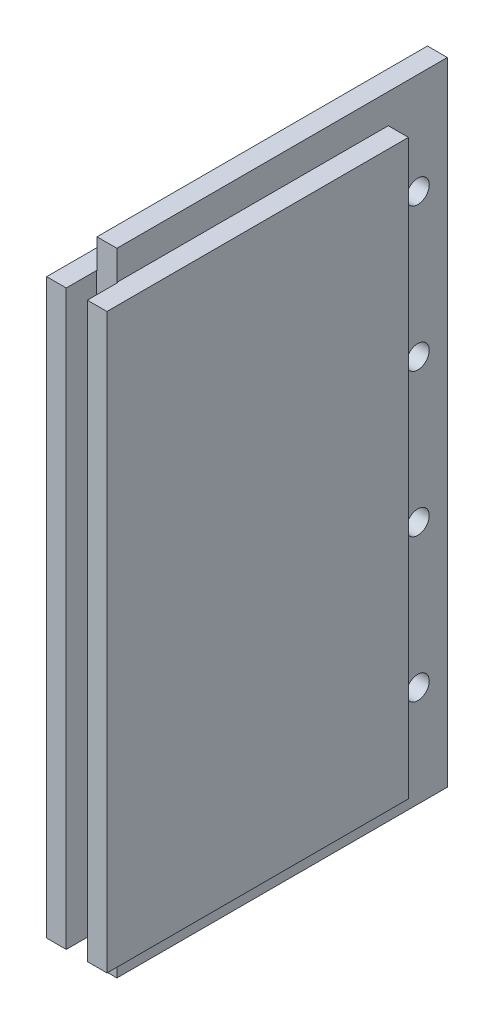
ISO-10303-21;
HEADER;
FILE_DESCRIPTION(('STEP AP214'),'2;1');
FILE_NAME('part.step','',(''),(''),'','','');
FILE_SCHEMA(('AUTOMOTIVE_DESIGN { 1 0 10303 214 1 1 1 1 }'));
ENDSEC;
DATA;
#1=APPLICATION_CONTEXT('core data for automotive mechanical design processes');
#2=APPLICATION_PROTOCOL_DEFINITION('international standard','automotive_design',2000,#1);
#3=PRODUCT_CONTEXT('',#1,'mechanical');
#4=PRODUCT('Part','Part','',(#3));
#5=PRODUCT_RELATED_PRODUCT_CATEGORY('part','',(#4));
#6=PRODUCT_DEFINITION_FORMATION('','',#4);
#7=PRODUCT_DEFINITION_CONTEXT('part definition',#1,'design');
#8=PRODUCT_DEFINITION('design','',#6,#7);
#9=PRODUCT_DEFINITION_SHAPE('','',#8);
#10=(LENGTH_UNIT() NAMED_UNIT(*) SI_UNIT(.MILLI.,.METRE.));
#11=(NAMED_UNIT(*) PLANE_ANGLE_UNIT() SI_UNIT($,.RADIAN.));
#12=(NAMED_UNIT(*) SI_UNIT($,.STERADIAN.) SOLID_ANGLE_UNIT());
#13=UNCERTAINTY_MEASURE_WITH_UNIT(LENGTH_MEASURE(1.E-05),#10,'distance_accuracy_value','');
#14=(GEOMETRIC_REPRESENTATION_CONTEXT(3) GLOBAL_UNCERTAINTY_ASSIGNED_CONTEXT((#13)) GLOBAL_UNIT_ASSIGNED_CONTEXT((#10,
#11,#12)) REPRESENTATION_CONTEXT('',''));
#15=CARTESIAN_POINT('',(0.,0.,0.));
#16=DIRECTION('',(0.,0.,1.));
#17=DIRECTION('',(1.,0.,0.));
#18=AXIS2_PLACEMENT_3D('',#15,#16,#17);
#19=CARTESIAN_POINT('',(-10.,0.,0.));
#20=DIRECTION('',(-1.,0.,0.));
#21=DIRECTION('',(0.,0.,1.));
#22=AXIS2_PLACEMENT_3D('',#19,#20,#21);
#23=PLANE('',#22);
#24=DIRECTION('',(0.,-1.,0.));
#25=VECTOR('',#24,1.);
#26=CARTESIAN_POINT('',(-10.,0.,42.5));
#27=LINE('',#26,#25);
#28=CARTESIAN_POINT('',(-10.,92.5,42.5));
#29=VERTEX_POINT('',#28);
#30=CARTESIAN_POINT('',(-10.,2.5,42.5));
#31=VERTEX_POINT('',#30);
#32=EDGE_CURVE('E200',#29,#31,#27,.T.);
#33=ORIENTED_EDGE('',*,*,#32,.T.);
#34=DIRECTION('',(0.,0.,-1.));
#35=VECTOR('',#34,1.);
#36=CARTESIAN_POINT('',(-10.,2.5,0.));
#37=LINE('',#36,#35);
#38=CARTESIAN_POINT('',(-10.,2.5,2.5));
#39=VERTEX_POINT('',#38);
#40=EDGE_CURVE('E11',#31,#39,#37,.T.);
#41=ORIENTED_EDGE('',*,*,#40,.T.);
#42=DIRECTION('',(0.,1.,0.));
#43=VECTOR('',#42,1.);
#44=CARTESIAN_POINT('',(-10.,90.,2.5));
#45=LINE('',#44,#43);
#46=CARTESIAN_POINT('',(-10.,92.5,2.5));
#47=VERTEX_POINT('',#46);
#48=EDGE_CURVE('E51',#39,#47,#45,.T.);
#49=ORIENTED_EDGE('',*,*,#48,.T.);
#50=DIRECTION('',(0.,0.,1.));
#51=VECTOR('',#50,1.);
#52=CARTESIAN_POINT('',(-10.,92.5,40.));
#53=LINE('',#52,#51);
#54=EDGE_CURVE('E207',#47,#29,#53,.T.);
#55=ORIENTED_EDGE('',*,*,#54,.T.);
#56=EDGE_LOOP('',(#33,#41,#49,#55));
#57=FACE_BOUND('',#56,.T.);
#58=DIRECTION('',(0.,0.,-1.));
#59=VECTOR('',#58,1.);
#60=CARTESIAN_POINT('',(-10.,0.,0.));
#61=LINE('',#60,#59);
#62=CARTESIAN_POINT('',(-10.,0.,50.));
#63=VERTEX_POINT('',#62);
#64=CARTESIAN_POINT('',(-10.,0.,0.));
#65=VERTEX_POINT('',#64);
#66=EDGE_CURVE('E247',#63,#65,#61,.T.);
#67=ORIENTED_EDGE('',*,*,#66,.F.);
#68=DIRECTION('',(0.,-1.,0.));
#69=VECTOR('',#68,1.);
#70=CARTESIAN_POINT('',(-10.,0.,50.));
#71=LINE('',#70,#69);
#72=CARTESIAN_POINT('',(-10.,95.,50.));
#73=VERTEX_POINT('',#72);
#74=EDGE_CURVE('E258',#73,#63,#71,.T.);
#75=ORIENTED_EDGE('',*,*,#74,.F.);
#76=DIRECTION('',(0.,0.,1.));
#77=VECTOR('',#76,1.);
#78=CARTESIAN_POINT('',(-10.,95.,0.));
#79=LINE('',#78,#77);
#80=CARTESIAN_POINT('',(-10.,95.,0.));
#81=VERTEX_POINT('',#80);
#82=EDGE_CURVE('E261',#81,#73,#79,.T.);
#83=ORIENTED_EDGE('',*,*,#82,.F.);
#84=DIRECTION('',(0.,1.,0.));
#85=VECTOR('',#84,1.);
#86=CARTESIAN_POINT('',(-10.,0.,0.));
#87=LINE('',#86,#85);
#88=EDGE_CURVE('E264',#65,#81,#87,.T.);
#89=ORIENTED_EDGE('',*,*,#88,.F.);
#90=EDGE_LOOP('',(#67,#75,#83,#89));
#91=FACE_BOUND('',#90,.T.);
#92=ADVANCED_FACE('F41',(#57,#91),#23,.T.);
#93=CARTESIAN_POINT('',(-10.,0.,50.));
#94=DIRECTION('',(0.,0.,1.));
#95=DIRECTION('',(1.,0.,0.));
#96=AXIS2_PLACEMENT_3D('',#93,#94,#95);
#97=PLANE('',#96);
#98=DIRECTION('',(0.,-1.,0.));
#99=VECTOR('',#98,1.);
#100=CARTESIAN_POINT('',(-6.75,99.9,50.));
#101=LINE('',#100,#99);
#102=CARTESIAN_POINT('',(-6.75,95.,50.));
#103=VERTEX_POINT('',#102);
#104=CARTESIAN_POINT('',(-6.74999999999999,0.,50.));
#105=VERTEX_POINT('',#104);
#106=EDGE_CURVE('E345',#103,#105,#101,.T.);
#107=ORIENTED_EDGE('',*,*,#106,.F.);
#108=DIRECTION('',(1.,0.,0.));
#109=VECTOR('',#108,1.);
#110=CARTESIAN_POINT('',(-10.,95.,50.));
#111=LINE('',#110,#109);
#112=EDGE_CURVE('E236',#73,#103,#111,.T.);
#113=ORIENTED_EDGE('',*,*,#112,.F.);
#114=ORIENTED_EDGE('',*,*,#74,.T.);
#115=DIRECTION('',(1.,0.,0.));
#116=VECTOR('',#115,1.);
#117=CARTESIAN_POINT('',(-10.,0.,50.));
#118=LINE('',#117,#116);
#119=EDGE_CURVE('E240',#63,#105,#118,.T.);
#120=ORIENTED_EDGE('',*,*,#119,.T.);
#121=EDGE_LOOP('',(#107,#113,#114,#120));
#122=FACE_BOUND('',#121,.T.);
#123=ADVANCED_FACE('F358',(#122),#97,.T.);
#124=CARTESIAN_POINT('',(-6.65,-10.340696301507,-9.8));
#125=DIRECTION('',(-1.,0.,0.));
#126=DIRECTION('',(0.,0.,1.));
#127=AXIS2_PLACEMENT_3D('',#124,#125,#126);
#128=PLANE('',#127);
#129=CARTESIAN_POINT('',(-6.65,35.625,-4.9));
#130=DIRECTION('',(-1.,0.,0.));
#131=DIRECTION('',(0.,0.,1.));
#132=AXIS2_PLACEMENT_3D('',#129,#130,#131);
#133=CIRCLE('',#132,1.9);
#134=CARTESIAN_POINT('',(-6.65,35.625,-6.8));
#135=VERTEX_POINT('',#134);
#136=EDGE_CURVE('E312',#135,#135,#133,.F.);
#137=ORIENTED_EDGE('',*,*,#136,.T.);
#138=EDGE_LOOP('',(#137));
#139=FACE_BOUND('',#138,.T.);
#140=CARTESIAN_POINT('',(-6.65,11.875,-4.9));
#141=DIRECTION('',(-1.,0.,0.));
#142=DIRECTION('',(0.,0.,1.));
#143=AXIS2_PLACEMENT_3D('',#140,#141,#142);
#144=CIRCLE('',#143,1.9);
#145=CARTESIAN_POINT('',(-6.65,11.875,-6.8));
#146=VERTEX_POINT('',#145);
#147=EDGE_CURVE('E304',#146,#146,#144,.F.);
#148=ORIENTED_EDGE('',*,*,#147,.T.);
#149=EDGE_LOOP('',(#148));
#150=FACE_BOUND('',#149,.T.);
#151=CARTESIAN_POINT('',(-6.65,59.375,-4.9));
#152=DIRECTION('',(-1.,0.,0.));
#153=DIRECTION('',(0.,0.,1.));
#154=AXIS2_PLACEMENT_3D('',#151,#152,#153);
#155=CIRCLE('',#154,1.9);
#156=CARTESIAN_POINT('',(-6.65,59.375,-6.8));
#157=VERTEX_POINT('',#156);
#158=EDGE_CURVE('E223',#157,#157,#155,.F.);
#159=ORIENTED_EDGE('',*,*,#158,.T.);
#160=EDGE_LOOP('',(#159));
#161=FACE_BOUND('',#160,.T.);
#162=CARTESIAN_POINT('',(-6.65,83.125,-4.9));
#163=DIRECTION('',(-1.,0.,0.));
#164=DIRECTION('',(0.,0.,1.));
#165=AXIS2_PLACEMENT_3D('',#162,#163,#164);
#166=CIRCLE('',#165,1.9);
#167=CARTESIAN_POINT('',(-6.65,83.125,-6.8));
#168=VERTEX_POINT('',#167);
#169=EDGE_CURVE('E217',#168,#168,#166,.F.);
#170=ORIENTED_EDGE('',*,*,#169,.T.);
#171=EDGE_LOOP('',(#170));
#172=FACE_BOUND('',#171,.T.);
#173=DIRECTION('',(0.,0.,1.));
#174=VECTOR('',#173,1.);
#175=CARTESIAN_POINT('',(-6.65,-4.9,50.));
#176=LINE('',#175,#174);
#177=CARTESIAN_POINT('',(-6.65,-4.9,-9.8));
#178=VERTEX_POINT('',#177);
#179=CARTESIAN_POINT('',(-6.65,-4.9,45.));
#180=VERTEX_POINT('',#179);
#181=EDGE_CURVE('E283',#178,#180,#176,.T.);
#182=ORIENTED_EDGE('',*,*,#181,.T.);
#183=DIRECTION('',(0.,1.,0.));
#184=VECTOR('',#183,1.);
#185=CARTESIAN_POINT('',(-6.65000000000001,-10.340696301507,45.));
#186=LINE('',#185,#184);
#187=CARTESIAN_POINT('',(-6.65000000000001,0.,45.));
#188=VERTEX_POINT('',#187);
#189=EDGE_CURVE('E324',#180,#188,#186,.T.);
#190=ORIENTED_EDGE('',*,*,#189,.T.);
#191=DIRECTION('',(0.,0.,1.));
#192=VECTOR('',#191,1.);
#193=CARTESIAN_POINT('',(-6.65,0.,50.));
#194=LINE('',#193,#192);
#195=CARTESIAN_POINT('',(-6.65,0.,0.));
#196=VERTEX_POINT('',#195);
#197=EDGE_CURVE('E226',#196,#188,#194,.T.);
#198=ORIENTED_EDGE('',*,*,#197,.F.);
#199=DIRECTION('',(0.,1.,0.));
#200=VECTOR('',#199,1.);
#201=CARTESIAN_POINT('',(-6.65,-10.340696301507,0.));
#202=LINE('',#201,#200);
#203=CARTESIAN_POINT('',(-6.65,95.,0.));
#204=VERTEX_POINT('',#203);
#205=EDGE_CURVE('E274',#196,#204,#202,.T.);
#206=ORIENTED_EDGE('',*,*,#205,.T.);
#207=DIRECTION('',(0.,0.,1.));
#208=VECTOR('',#207,1.);
#209=CARTESIAN_POINT('',(-6.65,95.,50.));
#210=LINE('',#209,#208);
#211=CARTESIAN_POINT('',(-6.65000000000001,95.,45.));
#212=VERTEX_POINT('',#211);
#213=EDGE_CURVE('E243',#204,#212,#210,.T.);
#214=ORIENTED_EDGE('',*,*,#213,.T.);
#215=CARTESIAN_POINT('',(-6.65,99.9,45.));
#216=VERTEX_POINT('',#215);
#217=EDGE_CURVE('E328',#212,#216,#186,.T.);
#218=ORIENTED_EDGE('',*,*,#217,.T.);
#219=DIRECTION('',(0.,0.,1.));
#220=VECTOR('',#219,1.);
#221=CARTESIAN_POINT('',(-6.65,99.9,50.));
#222=LINE('',#221,#220);
#223=CARTESIAN_POINT('',(-6.65,99.9,-9.8));
#224=VERTEX_POINT('',#223);
#225=EDGE_CURVE('E287',#224,#216,#222,.T.);
#226=ORIENTED_EDGE('',*,*,#225,.F.);
#227=DIRECTION('',(0.,1.,0.));
#228=VECTOR('',#227,1.);
#229=CARTESIAN_POINT('',(-6.65,-10.340696301507,-9.8));
#230=LINE('',#229,#228);
#231=EDGE_CURVE('E272',#178,#224,#230,.T.);
#232=ORIENTED_EDGE('',*,*,#231,.F.);
#233=EDGE_LOOP('',(#182,#190,#198,#206,#214,#218,#226,#232));
#234=FACE_BOUND('',#233,.T.);
#235=ADVANCED_FACE('F377',(#139,#150,#161,#172,#234),#128,.T.);
#236=CARTESIAN_POINT('',(-3.35,-10.340696301507,-9.8));
#237=DIRECTION('',(1.,0.,0.));
#238=DIRECTION('',(0.,0.,-1.));
#239=AXIS2_PLACEMENT_3D('',#236,#237,#238);
#240=PLANE('',#239);
#241=CARTESIAN_POINT('',(-3.35,35.625,-4.9));
#242=DIRECTION('',(1.,0.,0.));
#243=DIRECTION('',(0.,0.,-1.));
#244=AXIS2_PLACEMENT_3D('',#241,#242,#243);
#245=CIRCLE('',#244,1.9);
#246=CARTESIAN_POINT('',(-3.35,35.625,-6.8));
#247=VERTEX_POINT('',#246);
#248=EDGE_CURVE('E307',#247,#247,#245,.T.);
#249=ORIENTED_EDGE('',*,*,#248,.F.);
#250=EDGE_LOOP('',(#249));
#251=FACE_BOUND('',#250,.T.);
#252=CARTESIAN_POINT('',(-3.35,11.875,-4.9));
#253=DIRECTION('',(1.,0.,0.));
#254=DIRECTION('',(0.,0.,-1.));
#255=AXIS2_PLACEMENT_3D('',#252,#253,#254);
#256=CIRCLE('',#255,1.9);
#257=CARTESIAN_POINT('',(-3.35,11.875,-6.8));
#258=VERTEX_POINT('',#257);
#259=EDGE_CURVE('E297',#258,#258,#256,.T.);
#260=ORIENTED_EDGE('',*,*,#259,.F.);
#261=EDGE_LOOP('',(#260));
#262=FACE_BOUND('',#261,.T.);
#263=CARTESIAN_POINT('',(-3.35,59.375,-4.9));
#264=DIRECTION('',(1.,0.,0.));
#265=DIRECTION('',(0.,0.,-1.));
#266=AXIS2_PLACEMENT_3D('',#263,#264,#265);
#267=CIRCLE('',#266,1.9);
#268=CARTESIAN_POINT('',(-3.35,59.375,-6.8));
#269=VERTEX_POINT('',#268);
#270=EDGE_CURVE('E220',#269,#269,#267,.T.);
#271=ORIENTED_EDGE('',*,*,#270,.F.);
#272=EDGE_LOOP('',(#271));
#273=FACE_BOUND('',#272,.T.);
#274=CARTESIAN_POINT('',(-3.35,83.125,-4.9));
#275=DIRECTION('',(1.,0.,0.));
#276=DIRECTION('',(0.,0.,-1.));
#277=AXIS2_PLACEMENT_3D('',#274,#275,#276);
#278=CIRCLE('',#277,1.9);
#279=CARTESIAN_POINT('',(-3.35,83.125,-6.8));
#280=VERTEX_POINT('',#279);
#281=EDGE_CURVE('E214',#280,#280,#278,.T.);
#282=ORIENTED_EDGE('',*,*,#281,.F.);
#283=EDGE_LOOP('',(#282));
#284=FACE_BOUND('',#283,.T.);
#285=DIRECTION('',(0.,0.,-1.));
#286=VECTOR('',#285,1.);
#287=CARTESIAN_POINT('',(-3.35,99.9,50.));
#288=LINE('',#287,#286);
#289=CARTESIAN_POINT('',(-3.35,99.9,45.));
#290=VERTEX_POINT('',#289);
#291=CARTESIAN_POINT('',(-3.35,99.9,-9.8));
#292=VERTEX_POINT('',#291);
#293=EDGE_CURVE('E275',#290,#292,#288,.T.);
#294=ORIENTED_EDGE('',*,*,#293,.F.);
#295=DIRECTION('',(0.,-1.,0.));
#296=VECTOR('',#295,1.);
#297=CARTESIAN_POINT('',(-3.35,-10.340696301507,45.));
#298=LINE('',#297,#296);
#299=CARTESIAN_POINT('',(-3.35,95.,45.));
#300=VERTEX_POINT('',#299);
#301=EDGE_CURVE('E334',#290,#300,#298,.T.);
#302=ORIENTED_EDGE('',*,*,#301,.T.);
#303=DIRECTION('',(0.,0.,-1.));
#304=VECTOR('',#303,1.);
#305=CARTESIAN_POINT('',(-3.35,95.,50.));
#306=LINE('',#305,#304);
#307=CARTESIAN_POINT('',(-3.35,95.,0.));
#308=VERTEX_POINT('',#307);
#309=EDGE_CURVE('E280',#300,#308,#306,.T.);
#310=ORIENTED_EDGE('',*,*,#309,.T.);
#311=DIRECTION('',(0.,1.,0.));
#312=VECTOR('',#311,1.);
#313=CARTESIAN_POINT('',(-3.35,-10.340696301507,0.));
#314=LINE('',#313,#312);
#315=CARTESIAN_POINT('',(-3.35,0.,0.));
#316=VERTEX_POINT('',#315);
#317=EDGE_CURVE('E271',#316,#308,#314,.T.);
#318=ORIENTED_EDGE('',*,*,#317,.F.);
#319=DIRECTION('',(0.,0.,-1.));
#320=VECTOR('',#319,1.);
#321=CARTESIAN_POINT('',(-3.35,0.,50.));
#322=LINE('',#321,#320);
#323=CARTESIAN_POINT('',(-3.35,0.,45.));
#324=VERTEX_POINT('',#323);
#325=EDGE_CURVE('E294',#324,#316,#322,.T.);
#326=ORIENTED_EDGE('',*,*,#325,.F.);
#327=CARTESIAN_POINT('',(-3.35,-4.9,45.));
#328=VERTEX_POINT('',#327);
#329=EDGE_CURVE('E338',#324,#328,#298,.T.);
#330=ORIENTED_EDGE('',*,*,#329,.T.);
#331=DIRECTION('',(0.,0.,-1.));
#332=VECTOR('',#331,1.);
#333=CARTESIAN_POINT('',(-3.35,-4.9,50.));
#334=LINE('',#333,#332);
#335=CARTESIAN_POINT('',(-3.35,-4.9,-9.8));
#336=VERTEX_POINT('',#335);
#337=EDGE_CURVE('E300',#328,#336,#334,.T.);
#338=ORIENTED_EDGE('',*,*,#337,.T.);
#339=DIRECTION('',(0.,1.,0.));
#340=VECTOR('',#339,1.);
#341=CARTESIAN_POINT('',(-3.35,-10.340696301507,-9.8));
#342=LINE('',#341,#340);
#343=EDGE_CURVE('E257',#336,#292,#342,.T.);
#344=ORIENTED_EDGE('',*,*,#343,.T.);
#345=EDGE_LOOP('',(#294,#302,#310,#318,#326,#330,#338,#344));
#346=FACE_BOUND('',#345,.T.);
#347=ADVANCED_FACE('F389',(#251,#262,#273,#284,#346),#240,.T.);
#348=CARTESIAN_POINT('',(0.,99.9,0.));
#349=DIRECTION('',(0.,-1.,0.));
#350=DIRECTION('',(0.,0.,-1.));
#351=AXIS2_PLACEMENT_3D('',#348,#349,#350);
#352=PLANE('',#351);
#353=DIRECTION('',(-1.,0.,0.));
#354=VECTOR('',#353,1.);
#355=CARTESIAN_POINT('',(-6.75,99.9,45.));
#356=LINE('',#355,#354);
#357=EDGE_CURVE('E341',#290,#216,#356,.T.);
#358=ORIENTED_EDGE('',*,*,#357,.F.);
#359=ORIENTED_EDGE('',*,*,#293,.T.);
#360=DIRECTION('',(-1.,0.,0.));
#361=VECTOR('',#360,1.);
#362=CARTESIAN_POINT('',(-3.35,99.9,-9.8));
#363=LINE('',#362,#361);
#364=EDGE_CURVE('E282',#292,#224,#363,.T.);
#365=ORIENTED_EDGE('',*,*,#364,.T.);
#366=ORIENTED_EDGE('',*,*,#225,.T.);
#367=EDGE_LOOP('',(#358,#359,#365,#366));
#368=FACE_BOUND('',#367,.T.);
#369=ADVANCED_FACE('F397',(#368),#352,.F.);
#370=CARTESIAN_POINT('',(0.,-4.9,0.));
#371=DIRECTION('',(0.,1.,0.));
#372=DIRECTION('',(0.,0.,-1.));
#373=AXIS2_PLACEMENT_3D('',#370,#371,#372);
#374=PLANE('',#373);
#375=DIRECTION('',(1.,0.,0.));
#376=VECTOR('',#375,1.);
#377=CARTESIAN_POINT('',(0.,-4.9,45.));
#378=LINE('',#377,#376);
#379=EDGE_CURVE('E212',#180,#328,#378,.T.);
#380=ORIENTED_EDGE('',*,*,#379,.F.);
#381=ORIENTED_EDGE('',*,*,#181,.F.);
#382=DIRECTION('',(-1.,0.,0.));
#383=VECTOR('',#382,1.);
#384=CARTESIAN_POINT('',(-3.35,-4.9,-9.8));
#385=LINE('',#384,#383);
#386=EDGE_CURVE('E296',#336,#178,#385,.T.);
#387=ORIENTED_EDGE('',*,*,#386,.F.);
#388=ORIENTED_EDGE('',*,*,#337,.F.);
#389=EDGE_LOOP('',(#380,#381,#387,#388));
#390=FACE_BOUND('',#389,.T.);
#391=ADVANCED_FACE('F384',(#390),#374,.F.);
#392=CARTESIAN_POINT('',(-10.001,83.125,-4.9));
#393=DIRECTION('',(1.,0.,0.));
#394=DIRECTION('',(0.,0.,-1.));
#395=AXIS2_PLACEMENT_3D('',#392,#393,#394);
#396=CYLINDRICAL_SURFACE('',#395,1.9);
#397=CARTESIAN_POINT('',(-6.65,83.125,-6.8));
#398=CARTESIAN_POINT('',(-6.615625,83.125,-6.8));
#399=CARTESIAN_POINT('',(-6.58125,83.125,-6.8));
#400=CARTESIAN_POINT('',(-6.5125,83.125,-6.8));
#401=CARTESIAN_POINT('',(-6.478125,83.125,-6.8));
#402=CARTESIAN_POINT('',(-6.409375,83.125,-6.8));
#403=CARTESIAN_POINT('',(-6.375,83.125,-6.8));
#404=CARTESIAN_POINT('',(-6.30625,83.125,-6.8));
#405=CARTESIAN_POINT('',(-6.271875,83.125,-6.8));
#406=CARTESIAN_POINT('',(-6.203125,83.125,-6.8));
#407=CARTESIAN_POINT('',(-6.16875,83.125,-6.8));
#408=CARTESIAN_POINT('',(-6.1,83.125,-6.8));
#409=CARTESIAN_POINT('',(-6.065625,83.125,-6.8));
#410=CARTESIAN_POINT('',(-5.996875,83.125,-6.8));
#411=CARTESIAN_POINT('',(-5.9625,83.125,-6.8));
#412=CARTESIAN_POINT('',(-5.89375,83.125,-6.8));
#413=CARTESIAN_POINT('',(-5.859375,83.125,-6.8));
#414=CARTESIAN_POINT('',(-5.790625,83.125,-6.8));
#415=CARTESIAN_POINT('',(-5.75625,83.125,-6.8));
#416=CARTESIAN_POINT('',(-5.6875,83.125,-6.8));
#417=CARTESIAN_POINT('',(-5.653125,83.125,-6.8));
#418=CARTESIAN_POINT('',(-5.584375,83.125,-6.8));
#419=CARTESIAN_POINT('',(-5.55,83.125,-6.8));
#420=CARTESIAN_POINT('',(-5.48125,83.125,-6.8));
#421=CARTESIAN_POINT('',(-5.446875,83.125,-6.8));
#422=CARTESIAN_POINT('',(-5.378125,83.125,-6.8));
#423=CARTESIAN_POINT('',(-5.34375,83.125,-6.8));
#424=CARTESIAN_POINT('',(-5.275,83.125,-6.8));
#425=CARTESIAN_POINT('',(-5.240625,83.125,-6.8));
#426=CARTESIAN_POINT('',(-5.171875,83.125,-6.8));
#427=CARTESIAN_POINT('',(-5.1375,83.125,-6.8));
#428=CARTESIAN_POINT('',(-5.06875,83.125,-6.8));
#429=CARTESIAN_POINT('',(-5.034375,83.125,-6.8));
#430=CARTESIAN_POINT('',(-4.965625,83.125,-6.8));
#431=CARTESIAN_POINT('',(-4.93125,83.125,-6.8));
#432=CARTESIAN_POINT('',(-4.8625,83.125,-6.8));
#433=CARTESIAN_POINT('',(-4.828125,83.125,-6.8));
#434=CARTESIAN_POINT('',(-4.759375,83.125,-6.8));
#435=CARTESIAN_POINT('',(-4.725,83.125,-6.8));
#436=CARTESIAN_POINT('',(-4.65625,83.125,-6.8));
#437=CARTESIAN_POINT('',(-4.621875,83.125,-6.8));
#438=CARTESIAN_POINT('',(-4.553125,83.125,-6.8));
#439=CARTESIAN_POINT('',(-4.51875,83.125,-6.8));
#440=CARTESIAN_POINT('',(-4.45,83.125,-6.8));
#441=CARTESIAN_POINT('',(-4.415625,83.125,-6.8));
#442=CARTESIAN_POINT('',(-4.346875,83.125,-6.8));
#443=CARTESIAN_POINT('',(-4.3125,83.125,-6.8));
#444=CARTESIAN_POINT('',(-4.24375,83.125,-6.8));
#445=CARTESIAN_POINT('',(-4.209375,83.125,-6.8));
#446=CARTESIAN_POINT('',(-4.140625,83.125,-6.8));
#447=CARTESIAN_POINT('',(-4.10625,83.125,-6.8));
#448=CARTESIAN_POINT('',(-4.0375,83.125,-6.8));
#449=CARTESIAN_POINT('',(-4.003125,83.125,-6.8));
#450=CARTESIAN_POINT('',(-3.934375,83.125,-6.8));
#451=CARTESIAN_POINT('',(-3.9,83.125,-6.8));
#452=CARTESIAN_POINT('',(-3.83125,83.125,-6.8));
#453=CARTESIAN_POINT('',(-3.796875,83.125,-6.8));
#454=CARTESIAN_POINT('',(-3.728125,83.125,-6.8));
#455=CARTESIAN_POINT('',(-3.69375,83.125,-6.8));
#456=CARTESIAN_POINT('',(-3.625,83.125,-6.8));
#457=CARTESIAN_POINT('',(-3.590625,83.125,-6.8));
#458=CARTESIAN_POINT('',(-3.521875,83.125,-6.8));
#459=CARTESIAN_POINT('',(-3.4875,83.125,-6.8));
#460=CARTESIAN_POINT('',(-3.41875,83.125,-6.8));
#461=CARTESIAN_POINT('',(-3.384375,83.125,-6.8));
#462=CARTESIAN_POINT('',(-3.35,83.125,-6.8));
#463=B_SPLINE_CURVE_WITH_KNOTS('',3,(#397,#398,#399,#400,#401,#402,#403,#404,#405,#406,#407,
#408,#409,#410,#411,#412,#413,#414,#415,#416,#417,#418,#419,#420,#421,#422,#423,#424,#425,#426,
#427,#428,#429,#430,#431,#432,#433,#434,#435,#436,#437,#438,#439,#440,#441,#442,#443,#444,#445,
#446,#447,#448,#449,#450,#451,#452,#453,#454,#455,#456,#457,#458,#459,#460,#461,#462),
.UNSPECIFIED.,.F.,.F.,(4,2,2,2,2,2,2,2,2,2,2,2,2,2,2,2,2,2,2,2,2,2,2,2,2,2,2,2,2,2,2,2,4),(0.,
0.103124999999999,0.20625,0.309374999999999,0.4125,0.515624999999999,0.618749999999999,
0.721874999999999,0.824999999999999,0.928124999999999,1.03125,1.134375,1.2375,1.340625,1.44375,
1.546875,1.65,1.753125,1.85625,1.959375,2.0625,2.165625,2.26875,2.371875,2.475,2.578125,2.68125,
2.784375,2.8875,2.990625,3.09375,3.196875,3.3),.UNSPECIFIED.);
#464=EDGE_CURVE('BSEAM445',#168,#280,#463,.T.);
#465=ORIENTED_EDGE('',*,*,#169,.F.);
#466=ORIENTED_EDGE('',*,*,#281,.T.);
#467=ORIENTED_EDGE('',*,*,#464,.T.);
#468=ORIENTED_EDGE('',*,*,#464,.F.);
#469=EDGE_LOOP('',(#465,#467,#466,#468));
#470=FACE_BOUND('',#469,.T.);
#471=ADVANCED_FACE('F445',(#470),#396,.F.);
#472=CARTESIAN_POINT('',(-10.001,59.375,-4.9));
#473=DIRECTION('',(1.,0.,0.));
#474=DIRECTION('',(0.,0.,-1.));
#475=AXIS2_PLACEMENT_3D('',#472,#473,#474);
#476=CYLINDRICAL_SURFACE('',#475,1.9);
#477=CARTESIAN_POINT('',(-6.65,59.375,-6.8));
#478=CARTESIAN_POINT('',(-6.615625,59.375,-6.8));
#479=CARTESIAN_POINT('',(-6.58125,59.375,-6.8));
#480=CARTESIAN_POINT('',(-6.5125,59.375,-6.8));
#481=CARTESIAN_POINT('',(-6.478125,59.375,-6.8));
#482=CARTESIAN_POINT('',(-6.409375,59.375,-6.8));
#483=CARTESIAN_POINT('',(-6.375,59.375,-6.8));
#484=CARTESIAN_POINT('',(-6.30625,59.375,-6.8));
#485=CARTESIAN_POINT('',(-6.271875,59.375,-6.8));
#486=CARTESIAN_POINT('',(-6.203125,59.375,-6.8));
#487=CARTESIAN_POINT('',(-6.16875,59.375,-6.8));
#488=CARTESIAN_POINT('',(-6.1,59.375,-6.8));
#489=CARTESIAN_POINT('',(-6.065625,59.375,-6.8));
#490=CARTESIAN_POINT('',(-5.996875,59.375,-6.8));
#491=CARTESIAN_POINT('',(-5.9625,59.375,-6.8));
#492=CARTESIAN_POINT('',(-5.89375,59.375,-6.8));
#493=CARTESIAN_POINT('',(-5.859375,59.375,-6.8));
#494=CARTESIAN_POINT('',(-5.790625,59.375,-6.8));
#495=CARTESIAN_POINT('',(-5.75625,59.375,-6.8));
#496=CARTESIAN_POINT('',(-5.6875,59.375,-6.8));
#497=CARTESIAN_POINT('',(-5.653125,59.375,-6.8));
#498=CARTESIAN_POINT('',(-5.584375,59.375,-6.8));
#499=CARTESIAN_POINT('',(-5.55,59.375,-6.8));
#500=CARTESIAN_POINT('',(-5.48125,59.375,-6.8));
#501=CARTESIAN_POINT('',(-5.446875,59.375,-6.8));
#502=CARTESIAN_POINT('',(-5.378125,59.375,-6.8));
#503=CARTESIAN_POINT('',(-5.34375,59.375,-6.8));
#504=CARTESIAN_POINT('',(-5.275,59.375,-6.8));
#505=CARTESIAN_POINT('',(-5.240625,59.375,-6.8));
#506=CARTESIAN_POINT('',(-5.171875,59.375,-6.8));
#507=CARTESIAN_POINT('',(-5.1375,59.375,-6.8));
#508=CARTESIAN_POINT('',(-5.06875,59.375,-6.8));
#509=CARTESIAN_POINT('',(-5.034375,59.375,-6.8));
#510=CARTESIAN_POINT('',(-4.965625,59.375,-6.8));
#511=CARTESIAN_POINT('',(-4.93125,59.375,-6.8));
#512=CARTESIAN_POINT('',(-4.8625,59.375,-6.8));
#513=CARTESIAN_POINT('',(-4.828125,59.375,-6.8));
#514=CARTESIAN_POINT('',(-4.759375,59.375,-6.8));
#515=CARTESIAN_POINT('',(-4.725,59.375,-6.8));
#516=CARTESIAN_POINT('',(-4.65625,59.375,-6.8));
#517=CARTESIAN_POINT('',(-4.621875,59.375,-6.8));
#518=CARTESIAN_POINT('',(-4.553125,59.375,-6.8));
#519=CARTESIAN_POINT('',(-4.51875,59.375,-6.8));
#520=CARTESIAN_POINT('',(-4.45,59.375,-6.8));
#521=CARTESIAN_POINT('',(-4.415625,59.375,-6.8));
#522=CARTESIAN_POINT('',(-4.346875,59.375,-6.8));
#523=CARTESIAN_POINT('',(-4.3125,59.375,-6.8));
#524=CARTESIAN_POINT('',(-4.24375,59.375,-6.8));
#525=CARTESIAN_POINT('',(-4.209375,59.375,-6.8));
#526=CARTESIAN_POINT('',(-4.140625,59.375,-6.8));
#527=CARTESIAN_POINT('',(-4.10625,59.375,-6.8));
#528=CARTESIAN_POINT('',(-4.0375,59.375,-6.8));
#529=CARTESIAN_POINT('',(-4.003125,59.375,-6.8));
#530=CARTESIAN_POINT('',(-3.934375,59.375,-6.8));
#531=CARTESIAN_POINT('',(-3.9,59.375,-6.8));
#532=CARTESIAN_POINT('',(-3.83125,59.375,-6.8));
#533=CARTESIAN_POINT('',(-3.796875,59.375,-6.8));
#534=CARTESIAN_POINT('',(-3.728125,59.375,-6.8));
#535=CARTESIAN_POINT('',(-3.69375,59.375,-6.8));
#536=CARTESIAN_POINT('',(-3.625,59.375,-6.8));
#537=CARTESIAN_POINT('',(-3.590625,59.375,-6.8));
#538=CARTESIAN_POINT('',(-3.521875,59.375,-6.8));
#539=CARTESIAN_POINT('',(-3.4875,59.375,-6.8));
#540=CARTESIAN_POINT('',(-3.41875,59.375,-6.8));
#541=CARTESIAN_POINT('',(-3.384375,59.375,-6.8));
#542=CARTESIAN_POINT('',(-3.35,59.375,-6.8));
#543=B_SPLINE_CURVE_WITH_KNOTS('',3,(#477,#478,#479,#480,#481,#482,#483,#484,#485,#486,#487,
#488,#489,#490,#491,#492,#493,#494,#495,#496,#497,#498,#499,#500,#501,#502,#503,#504,#505,#506,
#507,#508,#509,#510,#511,#512,#513,#514,#515,#516,#517,#518,#519,#520,#521,#522,#523,#524,#525,
#526,#527,#528,#529,#530,#531,#532,#533,#534,#535,#536,#537,#538,#539,#540,#541,#542),
.UNSPECIFIED.,.F.,.F.,(4,2,2,2,2,2,2,2,2,2,2,2,2,2,2,2,2,2,2,2,2,2,2,2,2,2,2,2,2,2,2,2,4),(0.,
0.103124999999999,0.20625,0.309374999999999,0.4125,0.515624999999999,0.618749999999999,
0.721874999999999,0.824999999999999,0.928124999999999,1.03125,1.134375,1.2375,1.340625,1.44375,
1.546875,1.65,1.753125,1.85625,1.959375,2.0625,2.165625,2.26875,2.371875,2.475,2.578125,2.68125,
2.784375,2.8875,2.990625,3.09375,3.196875,3.3),.UNSPECIFIED.);
#544=EDGE_CURVE('BSEAM442',#157,#269,#543,.T.);
#545=ORIENTED_EDGE('',*,*,#158,.F.);
#546=ORIENTED_EDGE('',*,*,#270,.T.);
#547=ORIENTED_EDGE('',*,*,#544,.T.);
#548=ORIENTED_EDGE('',*,*,#544,.F.);
#549=EDGE_LOOP('',(#545,#547,#546,#548));
#550=FACE_BOUND('',#549,.T.);
#551=ADVANCED_FACE('F442',(#550),#476,.F.);
#552=CARTESIAN_POINT('',(-10.,0.,0.));
#553=DIRECTION('',(0.,-1.,0.));
#554=DIRECTION('',(0.,0.,-1.));
#555=AXIS2_PLACEMENT_3D('',#552,#553,#554);
#556=PLANE('',#555);
#557=DIRECTION('',(0.,0.,-1.));
#558=VECTOR('',#557,1.);
#559=CARTESIAN_POINT('',(-6.74999999999999,0.,0.));
#560=LINE('',#559,#558);
#561=CARTESIAN_POINT('',(-6.74999999999999,0.,45.));
#562=VERTEX_POINT('',#561);
#563=EDGE_CURVE('E319',#105,#562,#560,.T.);
#564=ORIENTED_EDGE('',*,*,#563,.F.);
#565=ORIENTED_EDGE('',*,*,#119,.F.);
#566=ORIENTED_EDGE('',*,*,#66,.T.);
#567=DIRECTION('',(1.,0.,0.));
#568=VECTOR('',#567,1.);
#569=CARTESIAN_POINT('',(-10.,0.,0.));
#570=LINE('',#569,#568);
#571=EDGE_CURVE('E227',#65,#196,#570,.T.);
#572=ORIENTED_EDGE('',*,*,#571,.T.);
#573=ORIENTED_EDGE('',*,*,#197,.T.);
#574=DIRECTION('',(-1.,0.,0.));
#575=VECTOR('',#574,1.);
#576=CARTESIAN_POINT('',(-10.,0.,45.));
#577=LINE('',#576,#575);
#578=EDGE_CURVE('E321',#188,#562,#577,.T.);
#579=ORIENTED_EDGE('',*,*,#578,.T.);
#580=EDGE_LOOP('',(#564,#565,#566,#572,#573,#579));
#581=FACE_BOUND('',#580,.T.);
#582=ADVANCED_FACE('F374',(#581),#556,.T.);
#583=DIRECTION('',(0.,0.,1.));
#584=VECTOR('',#583,1.);
#585=CARTESIAN_POINT('',(-3.25,0.,0.));
#586=LINE('',#585,#584);
#587=CARTESIAN_POINT('',(-3.25,0.,45.));
#588=VERTEX_POINT('',#587);
#589=CARTESIAN_POINT('',(-3.25,0.,50.));
#590=VERTEX_POINT('',#589);
#591=EDGE_CURVE('E315',#588,#590,#586,.T.);
#592=ORIENTED_EDGE('',*,*,#591,.F.);
#593=DIRECTION('',(-1.,0.,0.));
#594=VECTOR('',#593,1.);
#595=CARTESIAN_POINT('',(-10.,0.,45.));
#596=LINE('',#595,#594);
#597=EDGE_CURVE('E335',#588,#324,#596,.T.);
#598=ORIENTED_EDGE('',*,*,#597,.T.);
#599=ORIENTED_EDGE('',*,*,#325,.T.);
#600=CARTESIAN_POINT('',(0.,0.,0.));
#601=VERTEX_POINT('',#600);
#602=EDGE_CURVE('E231',#316,#601,#570,.T.);
#603=ORIENTED_EDGE('',*,*,#602,.T.);
#604=DIRECTION('',(0.,0.,-1.));
#605=VECTOR('',#604,1.);
#606=CARTESIAN_POINT('',(0.,0.,0.));
#607=LINE('',#606,#605);
#608=CARTESIAN_POINT('',(0.,0.,50.));
#609=VERTEX_POINT('',#608);
#610=EDGE_CURVE('E254',#609,#601,#607,.T.);
#611=ORIENTED_EDGE('',*,*,#610,.F.);
#612=EDGE_CURVE('E239',#590,#609,#118,.T.);
#613=ORIENTED_EDGE('',*,*,#612,.F.);
#614=EDGE_LOOP('',(#592,#598,#599,#603,#611,#613));
#615=FACE_BOUND('',#614,.T.);
#616=ADVANCED_FACE('F412',(#615),#556,.T.);
#617=CARTESIAN_POINT('',(-10.,95.,0.));
#618=DIRECTION('',(0.,1.,0.));
#619=DIRECTION('',(0.,0.,1.));
#620=AXIS2_PLACEMENT_3D('',#617,#618,#619);
#621=PLANE('',#620);
#622=DIRECTION('',(0.,0.,-1.));
#623=VECTOR('',#622,1.);
#624=CARTESIAN_POINT('',(-3.25,95.,0.));
#625=LINE('',#624,#623);
#626=CARTESIAN_POINT('',(-3.25,95.,50.));
#627=VERTEX_POINT('',#626);
#628=CARTESIAN_POINT('',(-3.25,95.,45.));
#629=VERTEX_POINT('',#628);
#630=EDGE_CURVE('E317',#627,#629,#625,.T.);
#631=ORIENTED_EDGE('',*,*,#630,.F.);
#632=CARTESIAN_POINT('',(0.,95.,50.));
#633=VERTEX_POINT('',#632);
#634=EDGE_CURVE('E235',#627,#633,#111,.T.);
#635=ORIENTED_EDGE('',*,*,#634,.T.);
#636=DIRECTION('',(0.,0.,1.));
#637=VECTOR('',#636,1.);
#638=CARTESIAN_POINT('',(0.,95.,0.));
#639=LINE('',#638,#637);
#640=CARTESIAN_POINT('',(0.,95.,0.));
#641=VERTEX_POINT('',#640);
#642=EDGE_CURVE('E248',#641,#633,#639,.T.);
#643=ORIENTED_EDGE('',*,*,#642,.F.);
#644=DIRECTION('',(1.,0.,0.));
#645=VECTOR('',#644,1.);
#646=CARTESIAN_POINT('',(-10.,95.,0.));
#647=LINE('',#646,#645);
#648=EDGE_CURVE('E230',#308,#641,#647,.T.);
#649=ORIENTED_EDGE('',*,*,#648,.F.);
#650=ORIENTED_EDGE('',*,*,#309,.F.);
#651=DIRECTION('',(1.,0.,0.));
#652=VECTOR('',#651,1.);
#653=CARTESIAN_POINT('',(-10.,95.,45.));
#654=LINE('',#653,#652);
#655=EDGE_CURVE('E331',#300,#629,#654,.T.);
#656=ORIENTED_EDGE('',*,*,#655,.T.);
#657=EDGE_LOOP('',(#631,#635,#643,#649,#650,#656));
#658=FACE_BOUND('',#657,.T.);
#659=ADVANCED_FACE('F404',(#658),#621,.T.);
#660=CARTESIAN_POINT('',(-10.,0.,0.));
#661=DIRECTION('',(0.,0.,-1.));
#662=DIRECTION('',(-1.,0.,0.));
#663=AXIS2_PLACEMENT_3D('',#660,#661,#662);
#664=PLANE('',#663);
#665=ORIENTED_EDGE('',*,*,#602,.F.);
#666=ORIENTED_EDGE('',*,*,#317,.T.);
#667=ORIENTED_EDGE('',*,*,#648,.T.);
#668=DIRECTION('',(0.,1.,0.));
#669=VECTOR('',#668,1.);
#670=CARTESIAN_POINT('',(0.,0.,0.));
#671=LINE('',#670,#669);
#672=EDGE_CURVE('E251',#601,#641,#671,.T.);
#673=ORIENTED_EDGE('',*,*,#672,.F.);
#674=EDGE_LOOP('',(#665,#666,#667,#673));
#675=FACE_BOUND('',#674,.T.);
#676=ADVANCED_FACE('F409',(#675),#664,.T.);
#677=DIRECTION('',(0.,1.,0.));
#678=VECTOR('',#677,1.);
#679=CARTESIAN_POINT('',(-3.25,99.9,50.));
#680=LINE('',#679,#678);
#681=EDGE_CURVE('E342',#590,#627,#680,.T.);
#682=ORIENTED_EDGE('',*,*,#681,.F.);
#683=ORIENTED_EDGE('',*,*,#612,.T.);
#684=DIRECTION('',(0.,-1.,0.));
#685=VECTOR('',#684,1.);
#686=CARTESIAN_POINT('',(0.,0.,50.));
#687=LINE('',#686,#685);
#688=EDGE_CURVE('E244',#633,#609,#687,.T.);
#689=ORIENTED_EDGE('',*,*,#688,.F.);
#690=ORIENTED_EDGE('',*,*,#634,.F.);
#691=EDGE_LOOP('',(#682,#683,#689,#690));
#692=FACE_BOUND('',#691,.T.);
#693=ADVANCED_FACE('F422',(#692),#97,.T.);
#694=DIRECTION('',(0.,0.,1.));
#695=VECTOR('',#694,1.);
#696=CARTESIAN_POINT('',(-6.75,95.,0.));
#697=LINE('',#696,#695);
#698=CARTESIAN_POINT('',(-6.75,95.,45.));
#699=VERTEX_POINT('',#698);
#700=EDGE_CURVE('E210',#699,#103,#697,.T.);
#701=ORIENTED_EDGE('',*,*,#700,.F.);
#702=DIRECTION('',(1.,0.,0.));
#703=VECTOR('',#702,1.);
#704=CARTESIAN_POINT('',(-10.,95.,45.));
#705=LINE('',#704,#703);
#706=EDGE_CURVE('E325',#699,#212,#705,.T.);
#707=ORIENTED_EDGE('',*,*,#706,.T.);
#708=ORIENTED_EDGE('',*,*,#213,.F.);
#709=EDGE_CURVE('E232',#81,#204,#647,.T.);
#710=ORIENTED_EDGE('',*,*,#709,.F.);
#711=ORIENTED_EDGE('',*,*,#82,.T.);
#712=ORIENTED_EDGE('',*,*,#112,.T.);
#713=EDGE_LOOP('',(#701,#707,#708,#710,#711,#712));
#714=FACE_BOUND('',#713,.T.);
#715=ADVANCED_FACE('F369',(#714),#621,.T.);
#716=ORIENTED_EDGE('',*,*,#205,.F.);
#717=ORIENTED_EDGE('',*,*,#571,.F.);
#718=ORIENTED_EDGE('',*,*,#88,.T.);
#719=ORIENTED_EDGE('',*,*,#709,.T.);
#720=EDGE_LOOP('',(#716,#717,#718,#719));
#721=FACE_BOUND('',#720,.T.);
#722=ADVANCED_FACE('F372',(#721),#664,.T.);
#723=CARTESIAN_POINT('',(0.,0.,0.));
#724=DIRECTION('',(-1.,0.,0.));
#725=DIRECTION('',(0.,0.,1.));
#726=AXIS2_PLACEMENT_3D('',#723,#724,#725);
#727=PLANE('',#726);
#728=ORIENTED_EDGE('',*,*,#610,.T.);
#729=ORIENTED_EDGE('',*,*,#672,.T.);
#730=ORIENTED_EDGE('',*,*,#642,.T.);
#731=ORIENTED_EDGE('',*,*,#688,.T.);
#732=EDGE_LOOP('',(#728,#729,#730,#731));
#733=FACE_BOUND('',#732,.T.);
#734=ADVANCED_FACE('F424',(#733),#727,.F.);
#735=CARTESIAN_POINT('',(-6.65,-10.340696301507,-9.8));
#736=DIRECTION('',(0.,0.,-1.));
#737=DIRECTION('',(-1.,0.,0.));
#738=AXIS2_PLACEMENT_3D('',#735,#736,#737);
#739=PLANE('',#738);
#740=ORIENTED_EDGE('',*,*,#343,.F.);
#741=ORIENTED_EDGE('',*,*,#386,.T.);
#742=ORIENTED_EDGE('',*,*,#231,.T.);
#743=ORIENTED_EDGE('',*,*,#364,.F.);
#744=EDGE_LOOP('',(#740,#741,#742,#743));
#745=FACE_BOUND('',#744,.T.);
#746=ADVANCED_FACE('F393',(#745),#739,.T.);
#747=CARTESIAN_POINT('',(-10.001,11.875,-4.9));
#748=DIRECTION('',(1.,0.,0.));
#749=DIRECTION('',(0.,0.,-1.));
#750=AXIS2_PLACEMENT_3D('',#747,#748,#749);
#751=CYLINDRICAL_SURFACE('',#750,1.9);
#752=CARTESIAN_POINT('',(-6.65,11.875,-6.8));
#753=CARTESIAN_POINT('',(-6.615625,11.875,-6.8));
#754=CARTESIAN_POINT('',(-6.58125,11.875,-6.8));
#755=CARTESIAN_POINT('',(-6.5125,11.875,-6.8));
#756=CARTESIAN_POINT('',(-6.478125,11.875,-6.8));
#757=CARTESIAN_POINT('',(-6.409375,11.875,-6.8));
#758=CARTESIAN_POINT('',(-6.375,11.875,-6.8));
#759=CARTESIAN_POINT('',(-6.30625,11.875,-6.8));
#760=CARTESIAN_POINT('',(-6.271875,11.875,-6.8));
#761=CARTESIAN_POINT('',(-6.203125,11.875,-6.8));
#762=CARTESIAN_POINT('',(-6.16875,11.875,-6.8));
#763=CARTESIAN_POINT('',(-6.1,11.875,-6.8));
#764=CARTESIAN_POINT('',(-6.065625,11.875,-6.8));
#765=CARTESIAN_POINT('',(-5.996875,11.875,-6.8));
#766=CARTESIAN_POINT('',(-5.9625,11.875,-6.8));
#767=CARTESIAN_POINT('',(-5.89375,11.875,-6.8));
#768=CARTESIAN_POINT('',(-5.859375,11.875,-6.8));
#769=CARTESIAN_POINT('',(-5.790625,11.875,-6.8));
#770=CARTESIAN_POINT('',(-5.75625,11.875,-6.8));
#771=CARTESIAN_POINT('',(-5.6875,11.875,-6.8));
#772=CARTESIAN_POINT('',(-5.653125,11.875,-6.8));
#773=CARTESIAN_POINT('',(-5.584375,11.875,-6.8));
#774=CARTESIAN_POINT('',(-5.55,11.875,-6.8));
#775=CARTESIAN_POINT('',(-5.48125,11.875,-6.8));
#776=CARTESIAN_POINT('',(-5.446875,11.875,-6.8));
#777=CARTESIAN_POINT('',(-5.378125,11.875,-6.8));
#778=CARTESIAN_POINT('',(-5.34375,11.875,-6.8));
#779=CARTESIAN_POINT('',(-5.275,11.875,-6.8));
#780=CARTESIAN_POINT('',(-5.240625,11.875,-6.8));
#781=CARTESIAN_POINT('',(-5.171875,11.875,-6.8));
#782=CARTESIAN_POINT('',(-5.1375,11.875,-6.8));
#783=CARTESIAN_POINT('',(-5.06875,11.875,-6.8));
#784=CARTESIAN_POINT('',(-5.034375,11.875,-6.8));
#785=CARTESIAN_POINT('',(-4.965625,11.875,-6.8));
#786=CARTESIAN_POINT('',(-4.93125,11.875,-6.8));
#787=CARTESIAN_POINT('',(-4.8625,11.875,-6.8));
#788=CARTESIAN_POINT('',(-4.828125,11.875,-6.8));
#789=CARTESIAN_POINT('',(-4.759375,11.875,-6.8));
#790=CARTESIAN_POINT('',(-4.725,11.875,-6.8));
#791=CARTESIAN_POINT('',(-4.65625,11.875,-6.8));
#792=CARTESIAN_POINT('',(-4.621875,11.875,-6.8));
#793=CARTESIAN_POINT('',(-4.553125,11.875,-6.8));
#794=CARTESIAN_POINT('',(-4.51875,11.875,-6.8));
#795=CARTESIAN_POINT('',(-4.45,11.875,-6.8));
#796=CARTESIAN_POINT('',(-4.415625,11.875,-6.8));
#797=CARTESIAN_POINT('',(-4.346875,11.875,-6.8));
#798=CARTESIAN_POINT('',(-4.3125,11.875,-6.8));
#799=CARTESIAN_POINT('',(-4.24375,11.875,-6.8));
#800=CARTESIAN_POINT('',(-4.209375,11.875,-6.8));
#801=CARTESIAN_POINT('',(-4.140625,11.875,-6.8));
#802=CARTESIAN_POINT('',(-4.10625,11.875,-6.8));
#803=CARTESIAN_POINT('',(-4.0375,11.875,-6.8));
#804=CARTESIAN_POINT('',(-4.003125,11.875,-6.8));
#805=CARTESIAN_POINT('',(-3.934375,11.875,-6.8));
#806=CARTESIAN_POINT('',(-3.9,11.875,-6.8));
#807=CARTESIAN_POINT('',(-3.83125,11.875,-6.8));
#808=CARTESIAN_POINT('',(-3.796875,11.875,-6.8));
#809=CARTESIAN_POINT('',(-3.728125,11.875,-6.8));
#810=CARTESIAN_POINT('',(-3.69375,11.875,-6.8));
#811=CARTESIAN_POINT('',(-3.625,11.875,-6.8));
#812=CARTESIAN_POINT('',(-3.590625,11.875,-6.8));
#813=CARTESIAN_POINT('',(-3.521875,11.875,-6.8));
#814=CARTESIAN_POINT('',(-3.4875,11.875,-6.8));
#815=CARTESIAN_POINT('',(-3.41875,11.875,-6.8));
#816=CARTESIAN_POINT('',(-3.384375,11.875,-6.8));
#817=CARTESIAN_POINT('',(-3.35,11.875,-6.8));
#818=B_SPLINE_CURVE_WITH_KNOTS('',3,(#752,#753,#754,#755,#756,#757,#758,#759,#760,#761,#762,
#763,#764,#765,#766,#767,#768,#769,#770,#771,#772,#773,#774,#775,#776,#777,#778,#779,#780,#781,
#782,#783,#784,#785,#786,#787,#788,#789,#790,#791,#792,#793,#794,#795,#796,#797,#798,#799,#800,
#801,#802,#803,#804,#805,#806,#807,#808,#809,#810,#811,#812,#813,#814,#815,#816,#817),
.UNSPECIFIED.,.F.,.F.,(4,2,2,2,2,2,2,2,2,2,2,2,2,2,2,2,2,2,2,2,2,2,2,2,2,2,2,2,2,2,2,2,4),(0.,
0.103124999999999,0.20625,0.309374999999999,0.4125,0.515624999999999,0.618749999999999,
0.721874999999999,0.824999999999999,0.928124999999999,1.03125,1.134375,1.2375,1.340625,1.44375,
1.546875,1.65,1.753125,1.85625,1.959375,2.0625,2.165625,2.26875,2.371875,2.475,2.578125,2.68125,
2.784375,2.8875,2.990625,3.09375,3.196875,3.3),.UNSPECIFIED.);
#819=EDGE_CURVE('BSEAM431',#146,#258,#818,.T.);
#820=ORIENTED_EDGE('',*,*,#147,.F.);
#821=ORIENTED_EDGE('',*,*,#259,.T.);
#822=ORIENTED_EDGE('',*,*,#819,.T.);
#823=ORIENTED_EDGE('',*,*,#819,.F.);
#824=EDGE_LOOP('',(#820,#822,#821,#823));
#825=FACE_BOUND('',#824,.T.);
#826=ADVANCED_FACE('F431',(#825),#751,.F.);
#827=CARTESIAN_POINT('',(-10.001,35.625,-4.9));
#828=DIRECTION('',(1.,0.,0.));
#829=DIRECTION('',(0.,0.,-1.));
#830=AXIS2_PLACEMENT_3D('',#827,#828,#829);
#831=CYLINDRICAL_SURFACE('',#830,1.9);
#832=CARTESIAN_POINT('',(-6.65,35.625,-6.8));
#833=CARTESIAN_POINT('',(-6.615625,35.625,-6.8));
#834=CARTESIAN_POINT('',(-6.58125,35.625,-6.8));
#835=CARTESIAN_POINT('',(-6.5125,35.625,-6.8));
#836=CARTESIAN_POINT('',(-6.478125,35.625,-6.8));
#837=CARTESIAN_POINT('',(-6.409375,35.625,-6.8));
#838=CARTESIAN_POINT('',(-6.375,35.625,-6.8));
#839=CARTESIAN_POINT('',(-6.30625,35.625,-6.8));
#840=CARTESIAN_POINT('',(-6.271875,35.625,-6.8));
#841=CARTESIAN_POINT('',(-6.203125,35.625,-6.8));
#842=CARTESIAN_POINT('',(-6.16875,35.625,-6.8));
#843=CARTESIAN_POINT('',(-6.1,35.625,-6.8));
#844=CARTESIAN_POINT('',(-6.065625,35.625,-6.8));
#845=CARTESIAN_POINT('',(-5.996875,35.625,-6.8));
#846=CARTESIAN_POINT('',(-5.9625,35.625,-6.8));
#847=CARTESIAN_POINT('',(-5.89375,35.625,-6.8));
#848=CARTESIAN_POINT('',(-5.859375,35.625,-6.8));
#849=CARTESIAN_POINT('',(-5.790625,35.625,-6.8));
#850=CARTESIAN_POINT('',(-5.75625,35.625,-6.8));
#851=CARTESIAN_POINT('',(-5.6875,35.625,-6.8));
#852=CARTESIAN_POINT('',(-5.653125,35.625,-6.8));
#853=CARTESIAN_POINT('',(-5.584375,35.625,-6.8));
#854=CARTESIAN_POINT('',(-5.55,35.625,-6.8));
#855=CARTESIAN_POINT('',(-5.48125,35.625,-6.8));
#856=CARTESIAN_POINT('',(-5.446875,35.625,-6.8));
#857=CARTESIAN_POINT('',(-5.378125,35.625,-6.8));
#858=CARTESIAN_POINT('',(-5.34375,35.625,-6.8));
#859=CARTESIAN_POINT('',(-5.275,35.625,-6.8));
#860=CARTESIAN_POINT('',(-5.240625,35.625,-6.8));
#861=CARTESIAN_POINT('',(-5.171875,35.625,-6.8));
#862=CARTESIAN_POINT('',(-5.1375,35.625,-6.8));
#863=CARTESIAN_POINT('',(-5.06875,35.625,-6.8));
#864=CARTESIAN_POINT('',(-5.034375,35.625,-6.8));
#865=CARTESIAN_POINT('',(-4.965625,35.625,-6.8));
#866=CARTESIAN_POINT('',(-4.93125,35.625,-6.8));
#867=CARTESIAN_POINT('',(-4.8625,35.625,-6.8));
#868=CARTESIAN_POINT('',(-4.828125,35.625,-6.8));
#869=CARTESIAN_POINT('',(-4.759375,35.625,-6.8));
#870=CARTESIAN_POINT('',(-4.725,35.625,-6.8));
#871=CARTESIAN_POINT('',(-4.65625,35.625,-6.8));
#872=CARTESIAN_POINT('',(-4.621875,35.625,-6.8));
#873=CARTESIAN_POINT('',(-4.553125,35.625,-6.8));
#874=CARTESIAN_POINT('',(-4.51875,35.625,-6.8));
#875=CARTESIAN_POINT('',(-4.45,35.625,-6.8));
#876=CARTESIAN_POINT('',(-4.415625,35.625,-6.8));
#877=CARTESIAN_POINT('',(-4.346875,35.625,-6.8));
#878=CARTESIAN_POINT('',(-4.3125,35.625,-6.8));
#879=CARTESIAN_POINT('',(-4.24375,35.625,-6.8));
#880=CARTESIAN_POINT('',(-4.209375,35.625,-6.8));
#881=CARTESIAN_POINT('',(-4.140625,35.625,-6.8));
#882=CARTESIAN_POINT('',(-4.10625,35.625,-6.8));
#883=CARTESIAN_POINT('',(-4.0375,35.625,-6.8));
#884=CARTESIAN_POINT('',(-4.003125,35.625,-6.8));
#885=CARTESIAN_POINT('',(-3.934375,35.625,-6.8));
#886=CARTESIAN_POINT('',(-3.9,35.625,-6.8));
#887=CARTESIAN_POINT('',(-3.83125,35.625,-6.8));
#888=CARTESIAN_POINT('',(-3.796875,35.625,-6.8));
#889=CARTESIAN_POINT('',(-3.728125,35.625,-6.8));
#890=CARTESIAN_POINT('',(-3.69375,35.625,-6.8));
#891=CARTESIAN_POINT('',(-3.625,35.625,-6.8));
#892=CARTESIAN_POINT('',(-3.590625,35.625,-6.8));
#893=CARTESIAN_POINT('',(-3.521875,35.625,-6.8));
#894=CARTESIAN_POINT('',(-3.4875,35.625,-6.8));
#895=CARTESIAN_POINT('',(-3.41875,35.625,-6.8));
#896=CARTESIAN_POINT('',(-3.384375,35.625,-6.8));
#897=CARTESIAN_POINT('',(-3.35,35.625,-6.8));
#898=B_SPLINE_CURVE_WITH_KNOTS('',3,(#832,#833,#834,#835,#836,#837,#838,#839,#840,#841,#842,
#843,#844,#845,#846,#847,#848,#849,#850,#851,#852,#853,#854,#855,#856,#857,#858,#859,#860,#861,
#862,#863,#864,#865,#866,#867,#868,#869,#870,#871,#872,#873,#874,#875,#876,#877,#878,#879,#880,
#881,#882,#883,#884,#885,#886,#887,#888,#889,#890,#891,#892,#893,#894,#895,#896,#897),
.UNSPECIFIED.,.F.,.F.,(4,2,2,2,2,2,2,2,2,2,2,2,2,2,2,2,2,2,2,2,2,2,2,2,2,2,2,2,2,2,2,2,4),(0.,
0.103124999999999,0.20625,0.309374999999999,0.4125,0.515624999999999,0.618749999999999,
0.721874999999999,0.824999999999999,0.928124999999999,1.03125,1.134375,1.2375,1.340625,1.44375,
1.546875,1.65,1.753125,1.85625,1.959375,2.0625,2.165625,2.26875,2.371875,2.475,2.578125,2.68125,
2.784375,2.8875,2.990625,3.09375,3.196875,3.3),.UNSPECIFIED.);
#899=EDGE_CURVE('BSEAM480',#135,#247,#898,.T.);
#900=ORIENTED_EDGE('',*,*,#136,.F.);
#901=ORIENTED_EDGE('',*,*,#248,.T.);
#902=ORIENTED_EDGE('',*,*,#899,.T.);
#903=ORIENTED_EDGE('',*,*,#899,.F.);
#904=EDGE_LOOP('',(#900,#902,#901,#903));
#905=FACE_BOUND('',#904,.T.);
#906=ADVANCED_FACE('F480',(#905),#831,.F.);
#907=CARTESIAN_POINT('',(-6.75,99.9,45.));
#908=DIRECTION('',(-1.,0.,0.));
#909=DIRECTION('',(0.,-1.,0.));
#910=AXIS2_PLACEMENT_3D('',#907,#908,#909);
#911=PLANE('',#910);
#912=ORIENTED_EDGE('',*,*,#563,.T.);
#913=DIRECTION('',(0.,-1.,0.));
#914=VECTOR('',#913,1.);
#915=CARTESIAN_POINT('',(-6.75,99.9,45.));
#916=LINE('',#915,#914);
#917=EDGE_CURVE('E344',#699,#562,#916,.T.);
#918=ORIENTED_EDGE('',*,*,#917,.F.);
#919=ORIENTED_EDGE('',*,*,#700,.T.);
#920=ORIENTED_EDGE('',*,*,#106,.T.);
#921=EDGE_LOOP('',(#912,#918,#919,#920));
#922=FACE_BOUND('',#921,.T.);
#923=ADVANCED_FACE('F477',(#922),#911,.F.);
#924=CARTESIAN_POINT('',(-3.25,99.9,45.));
#925=DIRECTION('',(1.,0.,0.));
#926=DIRECTION('',(0.,1.,0.));
#927=AXIS2_PLACEMENT_3D('',#924,#925,#926);
#928=PLANE('',#927);
#929=ORIENTED_EDGE('',*,*,#591,.T.);
#930=ORIENTED_EDGE('',*,*,#681,.T.);
#931=ORIENTED_EDGE('',*,*,#630,.T.);
#932=DIRECTION('',(0.,1.,0.));
#933=VECTOR('',#932,1.);
#934=CARTESIAN_POINT('',(-3.25,99.9,45.));
#935=LINE('',#934,#933);
#936=EDGE_CURVE('E348',#588,#629,#935,.T.);
#937=ORIENTED_EDGE('',*,*,#936,.F.);
#938=EDGE_LOOP('',(#929,#930,#931,#937));
#939=FACE_BOUND('',#938,.T.);
#940=ADVANCED_FACE('F417',(#939),#928,.F.);
#941=CARTESIAN_POINT('',(0.,0.,45.));
#942=DIRECTION('',(0.,0.,1.));
#943=DIRECTION('',(1.,0.,0.));
#944=AXIS2_PLACEMENT_3D('',#941,#942,#943);
#945=PLANE('',#944);
#946=ORIENTED_EDGE('',*,*,#189,.F.);
#947=ORIENTED_EDGE('',*,*,#379,.T.);
#948=ORIENTED_EDGE('',*,*,#329,.F.);
#949=ORIENTED_EDGE('',*,*,#597,.F.);
#950=ORIENTED_EDGE('',*,*,#936,.T.);
#951=ORIENTED_EDGE('',*,*,#655,.F.);
#952=ORIENTED_EDGE('',*,*,#301,.F.);
#953=ORIENTED_EDGE('',*,*,#357,.T.);
#954=ORIENTED_EDGE('',*,*,#217,.F.);
#955=ORIENTED_EDGE('',*,*,#706,.F.);
#956=ORIENTED_EDGE('',*,*,#917,.T.);
#957=ORIENTED_EDGE('',*,*,#578,.F.);
#958=EDGE_LOOP('',(#946,#947,#948,#949,#950,#951,#952,#953,#954,#955,#956,#957));
#959=FACE_BOUND('',#958,.T.);
#960=ADVANCED_FACE('F381',(#959),#945,.T.);
#961=CARTESIAN_POINT('',(-5.,0.,0.));
#962=DIRECTION('',(-1.,0.,0.));
#963=DIRECTION('',(0.,0.,1.));
#964=AXIS2_PLACEMENT_3D('',#961,#962,#963);
#965=PLANE('',#964);
#966=DIRECTION('',(0.,-1.,0.));
#967=VECTOR('',#966,1.);
#968=CARTESIAN_POINT('',(-5.,0.,40.));
#969=LINE('',#968,#967);
#970=CARTESIAN_POINT('',(-5.,90.,40.));
#971=VERTEX_POINT('',#970);
#972=CARTESIAN_POINT('',(-5.,5.,40.));
#973=VERTEX_POINT('',#972);
#974=EDGE_CURVE('E181',#971,#973,#969,.T.);
#975=ORIENTED_EDGE('',*,*,#974,.F.);
#976=DIRECTION('',(0.,0.,-1.));
#977=VECTOR('',#976,1.);
#978=CARTESIAN_POINT('',(-5.,90.,0.));
#979=LINE('',#978,#977);
#980=CARTESIAN_POINT('',(-5.,90.,5.));
#981=VERTEX_POINT('',#980);
#982=EDGE_CURVE('E184',#971,#981,#979,.T.);
#983=ORIENTED_EDGE('',*,*,#982,.T.);
#984=DIRECTION('',(0.,-1.,0.));
#985=VECTOR('',#984,1.);
#986=CARTESIAN_POINT('',(-5.,0.,5.));
#987=LINE('',#986,#985);
#988=CARTESIAN_POINT('',(-5.,5.,5.));
#989=VERTEX_POINT('',#988);
#990=EDGE_CURVE('E197',#981,#989,#987,.T.);
#991=ORIENTED_EDGE('',*,*,#990,.T.);
#992=DIRECTION('',(0.,0.,-1.));
#993=VECTOR('',#992,1.);
#994=CARTESIAN_POINT('',(-5.,5.,0.));
#995=LINE('',#994,#993);
#996=EDGE_CURVE('E186',#973,#989,#995,.T.);
#997=ORIENTED_EDGE('',*,*,#996,.F.);
#998=EDGE_LOOP('',(#975,#983,#991,#997));
#999=FACE_BOUND('',#998,.T.);
#1000=ADVANCED_FACE('F183',(#999),#965,.T.);
#1001=CARTESIAN_POINT('',(-4.99999999999997,90.,0.));
#1002=DIRECTION('',(-0.447213595499956,-0.894427190999917,0.));
#1003=DIRECTION('',(0.,0.,1.));
#1004=AXIS2_PLACEMENT_3D('',#1001,#1002,#1003);
#1005=PLANE('',#1004);
#1006=DIRECTION('',(0.816496580927727,-0.408248290463861,0.408248290463861));
#1007=VECTOR('',#1006,1.);
#1008=CARTESIAN_POINT('',(25.,75.0000000000001,19.9999999999999));
#1009=LINE('',#1008,#1007);
#1010=EDGE_CURVE('E195',#981,#47,#1009,.F.);
#1011=ORIENTED_EDGE('',*,*,#1010,.F.);
#1012=ORIENTED_EDGE('',*,*,#982,.F.);
#1013=DIRECTION('',(-0.816496580927727,0.408248290463861,0.408248290463861));
#1014=VECTOR('',#1013,1.);
#1015=CARTESIAN_POINT('',(8.33333333333334,83.3333333333334,33.3333333333334));
#1016=LINE('',#1015,#1014);
#1017=EDGE_CURVE('E46',#29,#971,#1016,.F.);
#1018=ORIENTED_EDGE('',*,*,#1017,.F.);
#1019=ORIENTED_EDGE('',*,*,#54,.F.);
#1020=EDGE_LOOP('',(#1011,#1012,#1018,#1019));
#1021=FACE_BOUND('',#1020,.T.);
#1022=ADVANCED_FACE('F44',(#1021),#1005,.T.);
#1023=CARTESIAN_POINT('',(-10.,0.,42.5));
#1024=DIRECTION('',(0.447213595499956,0.,0.894427190999917));
#1025=DIRECTION('',(0.,-1.,0.));
#1026=AXIS2_PLACEMENT_3D('',#1023,#1024,#1025);
#1027=PLANE('',#1026);
#1028=ORIENTED_EDGE('',*,*,#1017,.T.);
#1029=ORIENTED_EDGE('',*,*,#974,.T.);
#1030=DIRECTION('',(-0.816496580927727,-0.408248290463861,0.408248290463861));
#1031=VECTOR('',#1030,1.);
#1032=CARTESIAN_POINT('',(4.16666666666664,9.58333333333328,35.4166666666667));
#1033=LINE('',#1032,#1031);
#1034=EDGE_CURVE('E201',#31,#973,#1033,.F.);
#1035=ORIENTED_EDGE('',*,*,#1034,.F.);
#1036=ORIENTED_EDGE('',*,*,#32,.F.);
#1037=EDGE_LOOP('',(#1028,#1029,#1035,#1036));
#1038=FACE_BOUND('',#1037,.T.);
#1039=ADVANCED_FACE('F199',(#1038),#1027,.F.);
#1040=CARTESIAN_POINT('',(-4.99999999999997,0.,5.));
#1041=DIRECTION('',(-0.447213595499956,0.,0.894427190999917));
#1042=DIRECTION('',(0.,1.,0.));
#1043=AXIS2_PLACEMENT_3D('',#1040,#1041,#1042);
#1044=PLANE('',#1043);
#1045=ORIENTED_EDGE('',*,*,#1010,.T.);
#1046=ORIENTED_EDGE('',*,*,#48,.F.);
#1047=DIRECTION('',(-0.816496580927727,-0.408248290463862,-0.408248290463861));
#1048=VECTOR('',#1047,1.);
#1049=CARTESIAN_POINT('',(-10.8333333333333,2.08333333333333,2.08333333333333));
#1050=LINE('',#1049,#1048);
#1051=EDGE_CURVE('E59',#989,#39,#1050,.T.);
#1052=ORIENTED_EDGE('',*,*,#1051,.F.);
#1053=ORIENTED_EDGE('',*,*,#990,.F.);
#1054=EDGE_LOOP('',(#1045,#1046,#1052,#1053));
#1055=FACE_BOUND('',#1054,.T.);
#1056=ADVANCED_FACE('F355',(#1055),#1044,.T.);
#1057=CARTESIAN_POINT('',(-10.,2.5,0.));
#1058=DIRECTION('',(0.447213595499956,-0.894427190999917,0.));
#1059=DIRECTION('',(0.,0.,-1.));
#1060=AXIS2_PLACEMENT_3D('',#1057,#1058,#1059);
#1061=PLANE('',#1060);
#1062=ORIENTED_EDGE('',*,*,#1034,.T.);
#1063=ORIENTED_EDGE('',*,*,#996,.T.);
#1064=ORIENTED_EDGE('',*,*,#1051,.T.);
#1065=ORIENTED_EDGE('',*,*,#40,.F.);
#1066=EDGE_LOOP('',(#1062,#1063,#1064,#1065));
#1067=FACE_BOUND('',#1066,.T.);
#1068=ADVANCED_FACE('F354',(#1067),#1061,.F.);
#1069=CLOSED_SHELL('',(#92,#123,#235,#347,#369,#391,#471,#551,#582,#616,#659,#676,#693,#715,
#722,#734,#746,#826,#906,#923,#940,#960,#1000,#1022,#1039,#1056,#1068));
#1070=MANIFOLD_SOLID_BREP('B2',#1069);
#1071=ADVANCED_BREP_SHAPE_REPRESENTATION('',(#18,#1070),#14);
#1072=SHAPE_DEFINITION_REPRESENTATION(#9,#1071);
ENDSEC;
END-ISO-10303-21;
